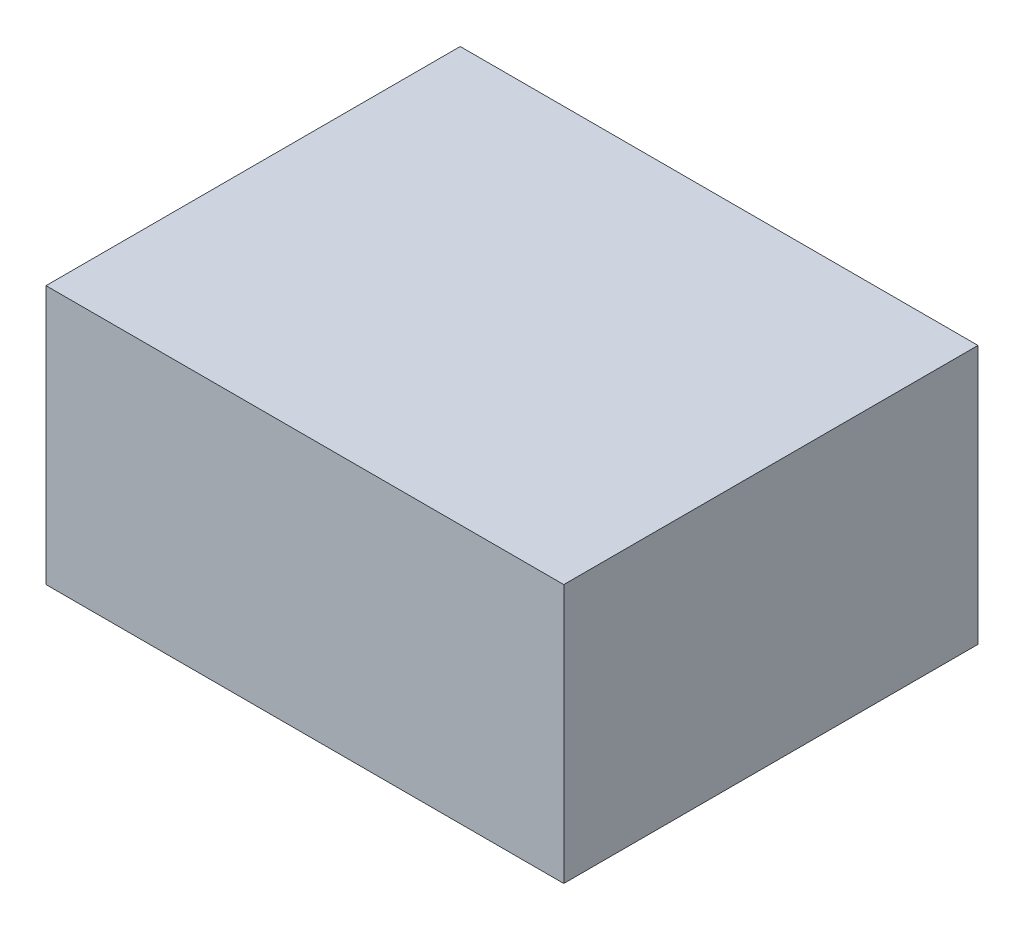
ISO-10303-21;
HEADER;
FILE_DESCRIPTION(('STEP AP214'),'2;1');
FILE_NAME('part.step','',(''),(''),'','','');
FILE_SCHEMA(('AUTOMOTIVE_DESIGN { 1 0 10303 214 1 1 1 1 }'));
ENDSEC;
DATA;
#1=APPLICATION_CONTEXT('core data for automotive mechanical design processes');
#2=APPLICATION_PROTOCOL_DEFINITION('international standard','automotive_design',2000,#1);
#3=PRODUCT_CONTEXT('',#1,'mechanical');
#4=PRODUCT('Part','Part','',(#3));
#5=PRODUCT_RELATED_PRODUCT_CATEGORY('part','',(#4));
#6=PRODUCT_DEFINITION_FORMATION('','',#4);
#7=PRODUCT_DEFINITION_CONTEXT('part definition',#1,'design');
#8=PRODUCT_DEFINITION('design','',#6,#7);
#9=PRODUCT_DEFINITION_SHAPE('','',#8);
#10=(LENGTH_UNIT() NAMED_UNIT(*) SI_UNIT(.MILLI.,.METRE.));
#11=(NAMED_UNIT(*) PLANE_ANGLE_UNIT() SI_UNIT($,.RADIAN.));
#12=(NAMED_UNIT(*) SI_UNIT($,.STERADIAN.) SOLID_ANGLE_UNIT());
#13=UNCERTAINTY_MEASURE_WITH_UNIT(LENGTH_MEASURE(1.E-05),#10,'distance_accuracy_value','');
#14=(GEOMETRIC_REPRESENTATION_CONTEXT(3) GLOBAL_UNCERTAINTY_ASSIGNED_CONTEXT((#13)) GLOBAL_UNIT_ASSIGNED_CONTEXT((#10,
#11,#12)) REPRESENTATION_CONTEXT('',''));
#15=CARTESIAN_POINT('',(0.,0.,0.));
#16=DIRECTION('',(0.,0.,1.));
#17=DIRECTION('',(1.,0.,0.));
#18=AXIS2_PLACEMENT_3D('',#15,#16,#17);
#19=CARTESIAN_POINT('',(5.00000016,2.50000008,0.));
#20=DIRECTION('',(0.,-1.,0.));
#21=DIRECTION('',(0.,0.,-1.));
#22=AXIS2_PLACEMENT_3D('',#19,#20,#21);
#23=PLANE('',#22);
#24=DIRECTION('',(0.,0.,-1.));
#25=VECTOR('',#24,1.);
#26=CARTESIAN_POINT('',(-5.00000016,2.50000008,0.));
#27=LINE('',#26,#25);
#28=CARTESIAN_POINT('',(-5.00000016,2.50000008,0.));
#29=VERTEX_POINT('',#28);
#30=CARTESIAN_POINT('',(-5.00000016,2.50000008,8.00000178));
#31=VERTEX_POINT('',#30);
#32=EDGE_CURVE('E20',#29,#31,#27,.F.);
#33=ORIENTED_EDGE('',*,*,#32,.T.);
#34=DIRECTION('',(-1.,0.,0.));
#35=VECTOR('',#34,1.);
#36=CARTESIAN_POINT('',(-5.00000016,2.50000008,8.00000178));
#37=LINE('',#36,#35);
#38=CARTESIAN_POINT('',(5.00000016,2.50000008,8.00000178));
#39=VERTEX_POINT('',#38);
#40=EDGE_CURVE('E55',#31,#39,#37,.F.);
#41=ORIENTED_EDGE('',*,*,#40,.T.);
#42=DIRECTION('',(0.,0.,1.));
#43=VECTOR('',#42,1.);
#44=CARTESIAN_POINT('',(5.00000016,2.50000008,0.));
#45=LINE('',#44,#43);
#46=CARTESIAN_POINT('',(5.00000016,2.50000008,0.));
#47=VERTEX_POINT('',#46);
#48=EDGE_CURVE('E74',#39,#47,#45,.F.);
#49=ORIENTED_EDGE('',*,*,#48,.T.);
#50=DIRECTION('',(-1.,0.,0.));
#51=VECTOR('',#50,1.);
#52=CARTESIAN_POINT('',(-5.00000016,2.50000008,0.));
#53=LINE('',#52,#51);
#54=EDGE_CURVE('E66',#29,#47,#53,.F.);
#55=ORIENTED_EDGE('',*,*,#54,.F.);
#56=EDGE_LOOP('',(#33,#41,#49,#55));
#57=FACE_BOUND('',#56,.T.);
#58=ADVANCED_FACE('F17',(#57),#23,.F.);
#59=CARTESIAN_POINT('',(-5.00000016,2.50000008,0.));
#60=DIRECTION('',(1.,0.,0.));
#61=DIRECTION('',(0.,0.,-1.));
#62=AXIS2_PLACEMENT_3D('',#59,#60,#61);
#63=PLANE('',#62);
#64=DIRECTION('',(0.,0.,1.));
#65=VECTOR('',#64,1.);
#66=CARTESIAN_POINT('',(-5.00000016,-2.50000008,0.));
#67=LINE('',#66,#65);
#68=CARTESIAN_POINT('',(-5.00000016,-2.50000008,0.));
#69=VERTEX_POINT('',#68);
#70=CARTESIAN_POINT('',(-5.00000016,-2.50000008,8.00000178));
#71=VERTEX_POINT('',#70);
#72=EDGE_CURVE('E72',#69,#71,#67,.T.);
#73=ORIENTED_EDGE('',*,*,#72,.T.);
#74=DIRECTION('',(0.,1.,0.));
#75=VECTOR('',#74,1.);
#76=CARTESIAN_POINT('',(-5.00000016,2.50000008,8.00000178));
#77=LINE('',#76,#75);
#78=EDGE_CURVE('E62',#71,#31,#77,.T.);
#79=ORIENTED_EDGE('',*,*,#78,.T.);
#80=ORIENTED_EDGE('',*,*,#32,.F.);
#81=DIRECTION('',(0.,1.,0.));
#82=VECTOR('',#81,1.);
#83=CARTESIAN_POINT('',(-5.00000016,2.50000008,0.));
#84=LINE('',#83,#82);
#85=EDGE_CURVE('E80',#69,#29,#84,.T.);
#86=ORIENTED_EDGE('',*,*,#85,.F.);
#87=EDGE_LOOP('',(#73,#79,#80,#86));
#88=FACE_BOUND('',#87,.T.);
#89=ADVANCED_FACE('F71',(#88),#63,.F.);
#90=CARTESIAN_POINT('',(-5.00000016,2.50000008,8.00000178));
#91=DIRECTION('',(0.,0.,-1.));
#92=DIRECTION('',(-1.,0.,0.));
#93=AXIS2_PLACEMENT_3D('',#90,#91,#92);
#94=PLANE('',#93);
#95=DIRECTION('',(1.,0.,0.));
#96=VECTOR('',#95,1.);
#97=CARTESIAN_POINT('',(-5.00000016,-2.50000008,8.00000178));
#98=LINE('',#97,#96);
#99=CARTESIAN_POINT('',(5.00000016,-2.50000008,8.00000178));
#100=VERTEX_POINT('',#99);
#101=EDGE_CURVE('E83',#71,#100,#98,.T.);
#102=ORIENTED_EDGE('',*,*,#101,.T.);
#103=DIRECTION('',(0.,1.,0.));
#104=VECTOR('',#103,1.);
#105=CARTESIAN_POINT('',(5.00000016,-2.50000008,8.00000178));
#106=LINE('',#105,#104);
#107=EDGE_CURVE('E64',#100,#39,#106,.T.);
#108=ORIENTED_EDGE('',*,*,#107,.T.);
#109=ORIENTED_EDGE('',*,*,#40,.F.);
#110=ORIENTED_EDGE('',*,*,#78,.F.);
#111=EDGE_LOOP('',(#102,#108,#109,#110));
#112=FACE_BOUND('',#111,.T.);
#113=ADVANCED_FACE('F60',(#112),#94,.F.);
#114=CARTESIAN_POINT('',(5.00000016,-2.50000008,0.));
#115=DIRECTION('',(-1.,0.,0.));
#116=DIRECTION('',(0.,0.,1.));
#117=AXIS2_PLACEMENT_3D('',#114,#115,#116);
#118=PLANE('',#117);
#119=ORIENTED_EDGE('',*,*,#48,.F.);
#120=ORIENTED_EDGE('',*,*,#107,.F.);
#121=DIRECTION('',(0.,0.,1.));
#122=VECTOR('',#121,1.);
#123=CARTESIAN_POINT('',(5.00000016,-2.50000008,0.));
#124=LINE('',#123,#122);
#125=CARTESIAN_POINT('',(5.00000016,-2.50000008,0.));
#126=VERTEX_POINT('',#125);
#127=EDGE_CURVE('E26',#100,#126,#124,.F.);
#128=ORIENTED_EDGE('',*,*,#127,.T.);
#129=DIRECTION('',(0.,1.,0.));
#130=VECTOR('',#129,1.);
#131=CARTESIAN_POINT('',(5.00000016,2.50000008,0.));
#132=LINE('',#131,#130);
#133=EDGE_CURVE('E34',#47,#126,#132,.F.);
#134=ORIENTED_EDGE('',*,*,#133,.F.);
#135=EDGE_LOOP('',(#119,#120,#128,#134));
#136=FACE_BOUND('',#135,.T.);
#137=ADVANCED_FACE('F88',(#136),#118,.F.);
#138=CARTESIAN_POINT('',(-5.00000016,2.50000008,0.));
#139=DIRECTION('',(0.,0.,-1.));
#140=DIRECTION('',(-1.,0.,0.));
#141=AXIS2_PLACEMENT_3D('',#138,#139,#140);
#142=PLANE('',#141);
#143=DIRECTION('',(1.,0.,0.));
#144=VECTOR('',#143,1.);
#145=CARTESIAN_POINT('',(-5.00000016,-2.50000008,0.));
#146=LINE('',#145,#144);
#147=EDGE_CURVE('E11',#126,#69,#146,.F.);
#148=ORIENTED_EDGE('',*,*,#147,.T.);
#149=ORIENTED_EDGE('',*,*,#85,.T.);
#150=ORIENTED_EDGE('',*,*,#54,.T.);
#151=ORIENTED_EDGE('',*,*,#133,.T.);
#152=EDGE_LOOP('',(#148,#149,#150,#151));
#153=FACE_BOUND('',#152,.T.);
#154=ADVANCED_FACE('F91',(#153),#142,.T.);
#155=CARTESIAN_POINT('',(-5.00000016,-2.50000008,0.));
#156=DIRECTION('',(0.,1.,0.));
#157=DIRECTION('',(0.,0.,1.));
#158=AXIS2_PLACEMENT_3D('',#155,#156,#157);
#159=PLANE('',#158);
#160=ORIENTED_EDGE('',*,*,#127,.F.);
#161=ORIENTED_EDGE('',*,*,#101,.F.);
#162=ORIENTED_EDGE('',*,*,#72,.F.);
#163=ORIENTED_EDGE('',*,*,#147,.F.);
#164=EDGE_LOOP('',(#160,#161,#162,#163));
#165=FACE_BOUND('',#164,.T.);
#166=ADVANCED_FACE('F90',(#165),#159,.F.);
#167=CLOSED_SHELL('',(#58,#89,#113,#137,#154,#166));
#168=MANIFOLD_SOLID_BREP('B1',#167);
#169=ADVANCED_BREP_SHAPE_REPRESENTATION('',(#18,#168),#14);
#170=SHAPE_DEFINITION_REPRESENTATION(#9,#169);
ENDSEC;
END-ISO-10303-21;
